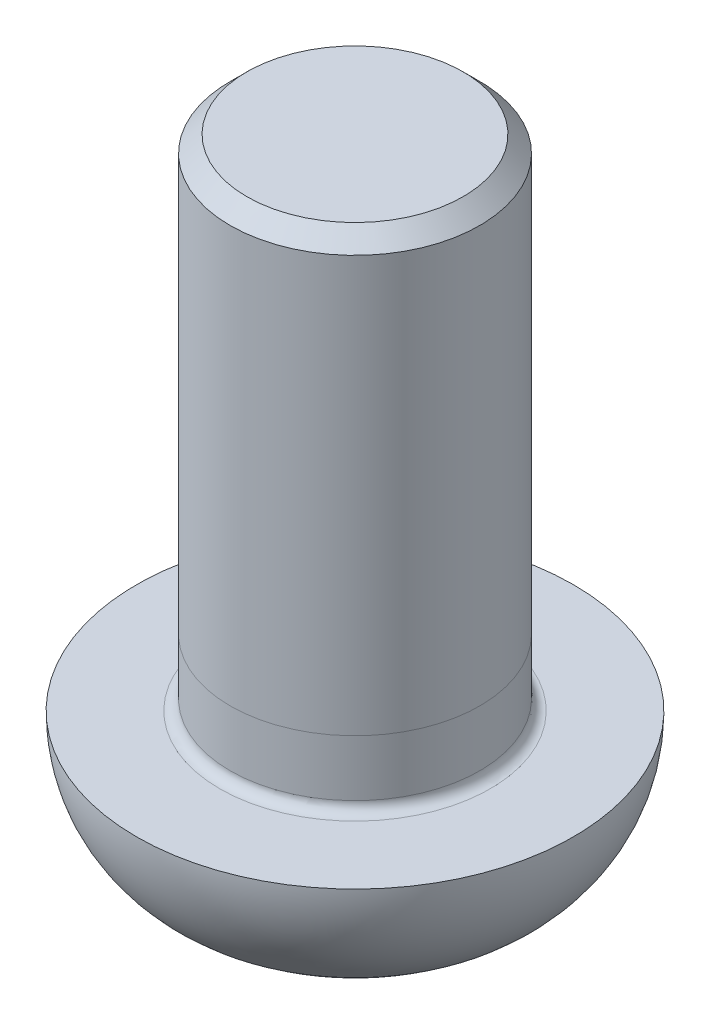
ISO-10303-21;
HEADER;
FILE_DESCRIPTION(('STEP AP214'),'2;1');
FILE_NAME('part.step','',(''),(''),'','','');
FILE_SCHEMA(('AUTOMOTIVE_DESIGN { 1 0 10303 214 1 1 1 1 }'));
ENDSEC;
DATA;
#1=APPLICATION_CONTEXT('core data for automotive mechanical design processes');
#2=APPLICATION_PROTOCOL_DEFINITION('international standard','automotive_design',2000,#1);
#3=PRODUCT_CONTEXT('',#1,'mechanical');
#4=PRODUCT('Part','Part','',(#3));
#5=PRODUCT_RELATED_PRODUCT_CATEGORY('part','',(#4));
#6=PRODUCT_DEFINITION_FORMATION('','',#4);
#7=PRODUCT_DEFINITION_CONTEXT('part definition',#1,'design');
#8=PRODUCT_DEFINITION('design','',#6,#7);
#9=PRODUCT_DEFINITION_SHAPE('','',#8);
#10=(LENGTH_UNIT() NAMED_UNIT(*) SI_UNIT(.MILLI.,.METRE.));
#11=(NAMED_UNIT(*) PLANE_ANGLE_UNIT() SI_UNIT($,.RADIAN.));
#12=(NAMED_UNIT(*) SI_UNIT($,.STERADIAN.) SOLID_ANGLE_UNIT());
#13=UNCERTAINTY_MEASURE_WITH_UNIT(LENGTH_MEASURE(1.E-05),#10,'distance_accuracy_value','');
#14=(GEOMETRIC_REPRESENTATION_CONTEXT(3) GLOBAL_UNCERTAINTY_ASSIGNED_CONTEXT((#13)) GLOBAL_UNIT_ASSIGNED_CONTEXT((#10,
#11,#12)) REPRESENTATION_CONTEXT('',''));
#15=CARTESIAN_POINT('',(0.,0.,0.));
#16=DIRECTION('',(0.,0.,1.));
#17=DIRECTION('',(1.,0.,0.));
#18=AXIS2_PLACEMENT_3D('',#15,#16,#17);
#19=CARTESIAN_POINT('',(0.,0.,0.));
#20=DIRECTION('',(0.,1.,0.));
#21=DIRECTION('',(0.,0.,1.));
#22=AXIS2_PLACEMENT_3D('',#19,#20,#21);
#23=CYLINDRICAL_SURFACE('',#22,3.);
#24=CARTESIAN_POINT('',(0.,11.6,0.));
#25=DIRECTION('',(0.,1.,0.));
#26=DIRECTION('',(0.,0.,1.));
#27=AXIS2_PLACEMENT_3D('',#24,#25,#26);
#28=CIRCLE('',#27,3.);
#29=CARTESIAN_POINT('',(0.,11.6,3.));
#30=VERTEX_POINT('',#29);
#31=EDGE_CURVE('E28',#30,#30,#28,.F.);
#32=ORIENTED_EDGE('',*,*,#31,.T.);
#33=EDGE_LOOP('',(#32));
#34=FACE_BOUND('',#33,.T.);
#35=CARTESIAN_POINT('',(0.,1.6,0.));
#36=DIRECTION('',(0.,1.,0.));
#37=DIRECTION('',(0.,0.,1.));
#38=AXIS2_PLACEMENT_3D('',#35,#36,#37);
#39=CIRCLE('',#38,3.);
#40=CARTESIAN_POINT('',(0.,1.6,3.));
#41=VERTEX_POINT('',#40);
#42=EDGE_CURVE('E11',#41,#41,#39,.T.);
#43=ORIENTED_EDGE('',*,*,#42,.T.);
#44=EDGE_LOOP('',(#43));
#45=FACE_BOUND('',#44,.T.);
#46=ADVANCED_FACE('F18',(#34,#45),#23,.T.);
#47=ORIENTED_EDGE('',*,*,#42,.F.);
#48=EDGE_LOOP('',(#47));
#49=FACE_BOUND('',#48,.T.);
#50=CARTESIAN_POINT('',(0.,0.25,0.));
#51=DIRECTION('',(0.,1.,0.));
#52=DIRECTION('',(0.,0.,1.));
#53=AXIS2_PLACEMENT_3D('',#50,#51,#52);
#54=CIRCLE('',#53,3.);
#55=CARTESIAN_POINT('',(0.,0.25,3.));
#56=VERTEX_POINT('',#55);
#57=EDGE_CURVE('E280',#56,#56,#54,.T.);
#58=ORIENTED_EDGE('',*,*,#57,.T.);
#59=EDGE_LOOP('',(#58));
#60=FACE_BOUND('',#59,.T.);
#61=ADVANCED_FACE('F192',(#49,#60),#23,.T.);
#62=CARTESIAN_POINT('',(5.25,0.,0.));
#63=DIRECTION('',(0.,1.,0.));
#64=DIRECTION('',(0.,0.,1.));
#65=AXIS2_PLACEMENT_3D('',#62,#63,#64);
#66=PLANE('',#65);
#67=CARTESIAN_POINT('',(0.,0.,0.));
#68=DIRECTION('',(0.,1.,0.));
#69=DIRECTION('',(0.,0.,1.));
#70=AXIS2_PLACEMENT_3D('',#67,#68,#69);
#71=CIRCLE('',#70,3.25);
#72=CARTESIAN_POINT('',(0.,0.,3.25));
#73=VERTEX_POINT('',#72);
#74=EDGE_CURVE('E277',#73,#73,#71,.F.);
#75=ORIENTED_EDGE('',*,*,#74,.T.);
#76=EDGE_LOOP('',(#75));
#77=FACE_BOUND('',#76,.T.);
#78=CARTESIAN_POINT('',(0.,0.,0.));
#79=DIRECTION('',(0.,1.,0.));
#80=DIRECTION('',(0.,0.,1.));
#81=AXIS2_PLACEMENT_3D('',#78,#79,#80);
#82=CIRCLE('',#81,5.25);
#83=CARTESIAN_POINT('',(0.,0.,5.25));
#84=VERTEX_POINT('',#83);
#85=EDGE_CURVE('E108',#84,#84,#82,.T.);
#86=ORIENTED_EDGE('',*,*,#85,.T.);
#87=EDGE_LOOP('',(#86));
#88=FACE_BOUND('',#87,.T.);
#89=ADVANCED_FACE('F199',(#77,#88),#66,.T.);
#90=CARTESIAN_POINT('',(0.,12.,0.));
#91=DIRECTION('',(0.,1.,0.));
#92=DIRECTION('',(0.,0.,1.));
#93=AXIS2_PLACEMENT_3D('',#90,#91,#92);
#94=PLANE('',#93);
#95=CARTESIAN_POINT('',(0.,12.,0.));
#96=DIRECTION('',(0.,1.,0.));
#97=DIRECTION('',(0.,0.,1.));
#98=AXIS2_PLACEMENT_3D('',#95,#96,#97);
#99=CIRCLE('',#98,2.6);
#100=CARTESIAN_POINT('',(0.,12.,2.6));
#101=VERTEX_POINT('',#100);
#102=EDGE_CURVE('E282',#101,#101,#99,.T.);
#103=ORIENTED_EDGE('',*,*,#102,.T.);
#104=EDGE_LOOP('',(#103));
#105=FACE_BOUND('',#104,.T.);
#106=ADVANCED_FACE('F227',(#105),#94,.T.);
#107=CARTESIAN_POINT('',(0.,0.25,0.));
#108=DIRECTION('',(0.,1.,0.));
#109=DIRECTION('',(0.,0.,1.));
#110=AXIS2_PLACEMENT_3D('',#107,#108,#109);
#111=TOROIDAL_SURFACE('',#110,3.25,0.25);
#112=ORIENTED_EDGE('',*,*,#74,.F.);
#113=EDGE_LOOP('',(#112));
#114=FACE_BOUND('',#113,.T.);
#115=ORIENTED_EDGE('',*,*,#57,.F.);
#116=EDGE_LOOP('',(#115));
#117=FACE_BOUND('',#116,.T.);
#118=ADVANCED_FACE('F265',(#114,#117),#111,.F.);
#119=CARTESIAN_POINT('',(0.,12.,0.));
#120=DIRECTION('',(0.,-1.,0.));
#121=DIRECTION('',(0.,0.,-1.));
#122=AXIS2_PLACEMENT_3D('',#119,#120,#121);
#123=CONICAL_SURFACE('',#122,2.6,0.785398163397449);
#124=ORIENTED_EDGE('',*,*,#31,.F.);
#125=EDGE_LOOP('',(#124));
#126=FACE_BOUND('',#125,.T.);
#127=ORIENTED_EDGE('',*,*,#102,.F.);
#128=EDGE_LOOP('',(#127));
#129=FACE_BOUND('',#128,.T.);
#130=ADVANCED_FACE('F21',(#126,#129),#123,.T.);
#131=CARTESIAN_POINT('',(0.,0.,0.));
#132=DIRECTION('',(0.,-1.,0.));
#133=DIRECTION('',(0.,0.,-1.));
#134=AXIS2_PLACEMENT_3D('',#131,#132,#133);
#135=DEGENERATE_TOROIDAL_SURFACE('',#134,1.67165208586472,3.57834791413527,.T.);
#136=ORIENTED_EDGE('',*,*,#85,.F.);
#137=EDGE_LOOP('',(#136));
#138=FACE_BOUND('',#137,.T.);
#139=CARTESIAN_POINT('',(0.,-3.3,0.));
#140=DIRECTION('',(0.,-1.,0.));
#141=DIRECTION('',(0.,0.,-1.));
#142=AXIS2_PLACEMENT_3D('',#139,#140,#141);
#143=CIRCLE('',#142,3.05533333333333);
#144=CARTESIAN_POINT('',(0.,-3.3,-3.05533333333333));
#145=VERTEX_POINT('',#144);
#146=EDGE_CURVE('E119',#145,#145,#143,.T.);
#147=ORIENTED_EDGE('',*,*,#146,.F.);
#148=EDGE_LOOP('',(#147));
#149=FACE_BOUND('',#148,.T.);
#150=ADVANCED_FACE('F143',(#138,#149),#135,.T.);
#151=CARTESIAN_POINT('',(0.,0.391673276442843,0.));
#152=DIRECTION('',(0.,-1.,0.));
#153=DIRECTION('',(0.,0.,-1.));
#154=AXIS2_PLACEMENT_3D('',#151,#152,#153);
#155=CONICAL_SURFACE('',#154,0.,1.0471975511966);
#156=CARTESIAN_POINT('',(0.,0.391673276442843,0.));
#157=VERTEX_POINT('',#156);
#158=VERTEX_LOOP('',#157);
#159=FACE_BOUND('',#158,.T.);
#160=CARTESIAN_POINT('',(-1.15458506832542,-0.94172672855691,2.0002));
#161=CARTESIAN_POINT('',(-1.20532911262018,-0.91241679803709,1.91230873709994));
#162=CARTESIAN_POINT('',(-1.2565111744778,-0.885760113916877,1.82365880552641));
#163=CARTESIAN_POINT('',(-1.3597616401932,-0.839229752957131,1.6448237530022));
#164=CARTESIAN_POINT('',(-1.41183187919145,-0.81937253831919,1.55463545349496));
#165=CARTESIAN_POINT('',(-1.51532701829184,-0.788460725959663,1.37537661423669));
#166=CARTESIAN_POINT('',(-1.56673599086579,-0.777200413534941,1.28633366177369));
#167=CARTESIAN_POINT('',(-1.66979593505374,-0.763755924531052,1.10782860221495));
#168=CARTESIAN_POINT('',(-1.72144653186531,-0.76156061688988,1.01836714429604));
#169=CARTESIAN_POINT('',(-1.81796535054794,-0.766118251267061,0.851191646451197));
#170=CARTESIAN_POINT('',(-1.86284799277603,-0.771752136623426,0.773452629734213));
#171=CARTESIAN_POINT('',(-1.95232085557725,-0.789611157197239,0.618481085463865));
#172=CARTESIAN_POINT('',(-1.99691076648955,-0.80184239795985,0.5412490942588));
#173=CARTESIAN_POINT('',(-2.08656822922817,-0.832420698804021,0.385957813517798));
#174=CARTESIAN_POINT('',(-2.13162442866767,-0.850897429002127,0.30791818689262));
#175=CARTESIAN_POINT('',(-2.221064675979,-0.892832780149267,0.153003134307866));
#176=CARTESIAN_POINT('',(-2.26544987045196,-0.916281542428724,0.0761257223768807));
#177=CARTESIAN_POINT('',(-2.30951654681234,-0.941726728556909,-0.000200000000000072));
#178=B_SPLINE_CURVE_WITH_KNOTS('',3,(#160,#161,#162,#163,#164,#165,#166,#167,#168,#169,#170,
#171,#172,#173,#174,#175,#176,#177),.UNSPECIFIED.,.F.,.F.,(4,2,2,2,2,2,2,2,4),(0.,
0.317031824695611,0.634825876346566,0.944753967652639,1.25430138000372,1.52387047293094,
1.79368946861028,2.06949491027634,2.34475850821472),.UNSPECIFIED.);
#179=CARTESIAN_POINT('',(-1.15470053837926,-0.941660056890493,2.));
#180=VERTEX_POINT('',#179);
#181=CARTESIAN_POINT('',(-2.3094010767585,-0.941660056890492,0.));
#182=VERTEX_POINT('',#181);
#183=EDGE_CURVE('E231',#180,#182,#178,.T.);
#184=ORIENTED_EDGE('',*,*,#183,.T.);
#185=CARTESIAN_POINT('',(-2.30951654681234,-0.941726728556909,0.000200000000000068));
#186=CARTESIAN_POINT('',(-2.25877250251757,-0.912416798037087,-0.0876912629000592));
#187=CARTESIAN_POINT('',(-2.20759044065995,-0.885760113916874,-0.17634119447359));
#188=CARTESIAN_POINT('',(-2.10433997494456,-0.839229752957128,-0.355176246997801));
#189=CARTESIAN_POINT('',(-2.0522697359463,-0.819372538319187,-0.445364546505036));
#190=CARTESIAN_POINT('',(-1.94877459684592,-0.78846072595966,-0.624623385763305));
#191=CARTESIAN_POINT('',(-1.89736562427197,-0.777200413534938,-0.713666338226303));
#192=CARTESIAN_POINT('',(-1.79430568008402,-0.76375592453105,-0.892171397785043));
#193=CARTESIAN_POINT('',(-1.74265508327244,-0.761560616889878,-0.981632855703958));
#194=CARTESIAN_POINT('',(-1.64613626458981,-0.766118251267059,-1.1488083535488));
#195=CARTESIAN_POINT('',(-1.60125362236172,-0.771752136623423,-1.22654737026578));
#196=CARTESIAN_POINT('',(-1.5117807595605,-0.789611157197236,-1.38151891453613));
#197=CARTESIAN_POINT('',(-1.46719084864821,-0.801842397959847,-1.4587509057412));
#198=CARTESIAN_POINT('',(-1.37753338590959,-0.832420698804018,-1.6140421864822));
#199=CARTESIAN_POINT('',(-1.33247718647008,-0.850897429002124,-1.69208181310738));
#200=CARTESIAN_POINT('',(-1.24303693915875,-0.892832780149265,-1.84699686569214));
#201=CARTESIAN_POINT('',(-1.19865174468579,-0.916281542428723,-1.92387427762312));
#202=CARTESIAN_POINT('',(-1.15458506832541,-0.94172672855691,-2.0002));
#203=B_SPLINE_CURVE_WITH_KNOTS('',3,(#185,#186,#187,#188,#189,#190,#191,#192,#193,#194,#195,
#196,#197,#198,#199,#200,#201,#202),.UNSPECIFIED.,.F.,.F.,(4,2,2,2,2,2,2,2,4),(0.,
0.317031824695611,0.634825876346565,0.944753967652637,1.25430138000371,1.52387047293094,
1.79368946861029,2.06949491027634,2.34475850821473),.UNSPECIFIED.);
#204=CARTESIAN_POINT('',(-1.15470053837925,-0.941660056890493,-2.));
#205=VERTEX_POINT('',#204);
#206=EDGE_CURVE('E210',#182,#205,#203,.T.);
#207=ORIENTED_EDGE('',*,*,#206,.T.);
#208=CARTESIAN_POINT('',(-3.97107242292986,-2.17538835040825,-2.));
#209=CARTESIAN_POINT('',(-3.87868247277526,-2.12775059746127,-2.));
#210=CARTESIAN_POINT('',(-3.7861588003778,-2.08037372958414,-2.));
#211=CARTESIAN_POINT('',(-3.60078450821548,-1.98626017948102,-2.00000000000001));
#212=CARTESIAN_POINT('',(-3.50793388259158,-1.93952350880157,-2.00000000000001));
#213=CARTESIAN_POINT('',(-3.22850900761148,-1.80030535880982,-2.));
#214=CARTESIAN_POINT('',(-3.04135761037277,-1.70896924768975,-2.));
#215=CARTESIAN_POINT('',(-2.75397555619272,-1.5731154540905,-2.));
#216=CARTESIAN_POINT('',(-2.65454530475032,-1.52690595800733,-2.));
#217=CARTESIAN_POINT('',(-2.45492785759602,-1.43615536855376,-2.));
#218=CARTESIAN_POINT('',(-2.3547406899451,-1.39161421369455,-2.));
#219=CARTESIAN_POINT('',(-2.15350213975009,-1.30470652650298,-2.));
#220=CARTESIAN_POINT('',(-2.05245137959688,-1.26233856057289,-2.));
#221=CARTESIAN_POINT('',(-1.84919030086332,-1.18039650371769,-2.));
#222=CARTESIAN_POINT('',(-1.74697972173689,-1.14082305558609,-2.));
#223=CARTESIAN_POINT('',(-1.52508206994959,-1.05946514421621,-2.));
#224=CARTESIAN_POINT('',(-1.40516322629618,-1.01830385306277,-2.));
#225=CARTESIAN_POINT('',(-1.16321218809007,-0.942832074454553,-2.));
#226=CARTESIAN_POINT('',(-1.04118108489843,-0.908518157540933,-2.));
#227=CARTESIAN_POINT('',(-0.797191699347654,-0.849762632395411,-2.));
#228=CARTESIAN_POINT('',(-0.675277439673617,-0.825143320410585,-2.));
#229=CARTESIAN_POINT('',(-0.42968597996561,-0.78740551194056,-2.));
#230=CARTESIAN_POINT('',(-0.306009864773069,-0.774280224898857,-2.));
#231=CARTESIAN_POINT('',(-0.0561948130021474,-0.761222818220792,-2.));
#232=CARTESIAN_POINT('',(0.0699543957642671,-0.761477523372083,-2.));
#233=CARTESIAN_POINT('',(0.321490472578919,-0.775609005131668,-2.));
#234=CARTESIAN_POINT('',(0.446877078128915,-0.789490231676833,-2.));
#235=CARTESIAN_POINT('',(0.698268076239721,-0.829339251040338,-2.));
#236=CARTESIAN_POINT('',(0.824232704616094,-0.855548309192251,-1.99999999999999));
#237=CARTESIAN_POINT('',(1.07382197335698,-0.917314019236256,-2.));
#238=CARTESIAN_POINT('',(1.19744582529425,-0.952873762658447,-2.));
#239=CARTESIAN_POINT('',(1.43877717975325,-1.02962266424125,-2.));
#240=CARTESIAN_POINT('',(1.55655051066925,-1.07060890554915,-2.));
#241=CARTESIAN_POINT('',(1.79038315988528,-1.15724391469459,-1.99999999999999));
#242=CARTESIAN_POINT('',(1.90644203337208,-1.20289386902531,-1.99999999999999));
#243=CARTESIAN_POINT('',(2.13727613898438,-1.29764227315016,-1.99999999999999));
#244=CARTESIAN_POINT('',(2.25204987258198,-1.3467443434052,-1.99999999999999));
#245=CARTESIAN_POINT('',(2.48048565996255,-1.44747310577301,-1.99999999999999));
#246=CARTESIAN_POINT('',(2.59414765093807,-1.499099939544,-1.99999999999999));
#247=CARTESIAN_POINT('',(2.81406706680889,-1.60122748447267,-1.99999999999999));
#248=CARTESIAN_POINT('',(2.92037405177845,-1.65162191070667,-1.99999999999999));
#249=CARTESIAN_POINT('',(3.1323563665145,-1.75372845058398,-1.99999999999999));
#250=CARTESIAN_POINT('',(3.23803167473215,-1.80544060886685,-1.99999999999999));
#251=CARTESIAN_POINT('',(3.44851064882037,-1.90972549113419,-1.99999999999999));
#252=CARTESIAN_POINT('',(3.55331605390046,-1.96229471304186,-1.99999999999999));
#253=CARTESIAN_POINT('',(3.7624942913087,-2.06826501338616,-1.99999999999999));
#254=CARTESIAN_POINT('',(3.86686716058578,-2.12166601883339,-1.99999999999999));
#255=CARTESIAN_POINT('',(3.97107242292986,-2.17538835040825,-2.));
#256=B_SPLINE_CURVE_WITH_KNOTS('',3,(#208,#209,#210,#211,#212,#213,#214,#215,#216,#217,#218,
#219,#220,#221,#222,#223,#224,#225,#226,#227,#228,#229,#230,#231,#232,#233,#234,#235,#236,#237,
#238,#239,#240,#241,#242,#243,#244,#245,#246,#247,#248,#249,#250,#251,#252,#253,#254,#255),
.UNSPECIFIED.,.F.,.F.,(4,2,2,2,2,2,2,2,2,2,2,2,2,2,2,2,2,2,2,2,2,2,2,4),(0.,0.311842723826934,
0.62369106463389,1.24838758455579,1.57730682351192,1.90621392778465,2.23490119378745,
2.56366381964157,2.94387628317646,3.32389783939494,3.69658721194995,4.06905625447051,
4.44672744508521,4.82452201071132,5.21003920255201,5.59568401496473,5.96965872681082,
6.34372881945369,6.71819725104189,7.09268671728378,7.44561614609446,7.79855754669429,
8.15030525169476,8.50202226264185),.UNSPECIFIED.);
#257=CARTESIAN_POINT('',(1.15470053837925,-0.941660056890493,-2.));
#258=VERTEX_POINT('',#257);
#259=EDGE_CURVE('E106',#205,#258,#256,.T.);
#260=ORIENTED_EDGE('',*,*,#259,.T.);
#261=CARTESIAN_POINT('',(1.15458506832542,-0.941726728556909,-2.0002));
#262=CARTESIAN_POINT('',(1.20532911262018,-0.91241679803709,-1.91230873709994));
#263=CARTESIAN_POINT('',(1.2565111744778,-0.885760113916877,-1.82365880552641));
#264=CARTESIAN_POINT('',(1.3597616401932,-0.839229752957131,-1.6448237530022));
#265=CARTESIAN_POINT('',(1.41183187919145,-0.819372538319189,-1.55463545349496));
#266=CARTESIAN_POINT('',(1.51532701829183,-0.788460725959662,-1.37537661423669));
#267=CARTESIAN_POINT('',(1.56673599086579,-0.777200413534941,-1.2863336617737));
#268=CARTESIAN_POINT('',(1.66979593505373,-0.763755924531052,-1.10782860221496));
#269=CARTESIAN_POINT('',(1.72144653186531,-0.761560616889879,-1.01836714429604));
#270=CARTESIAN_POINT('',(1.81796535054794,-0.76611825126706,-0.851191646451198));
#271=CARTESIAN_POINT('',(1.86284799277603,-0.771752136623425,-0.773452629734215));
#272=CARTESIAN_POINT('',(1.95232085557725,-0.789611157197239,-0.618481085463866));
#273=CARTESIAN_POINT('',(1.99691076648955,-0.80184239795985,-0.541249094258801));
#274=CARTESIAN_POINT('',(2.08656822922816,-0.832420698804021,-0.385957813517798));
#275=CARTESIAN_POINT('',(2.13162442866767,-0.850897429002127,-0.307918186892619));
#276=CARTESIAN_POINT('',(2.221064675979,-0.892832780149267,-0.153003134307864));
#277=CARTESIAN_POINT('',(2.26544987045196,-0.916281542428725,-0.0761257223768781));
#278=CARTESIAN_POINT('',(2.30951654681234,-0.941726728556909,0.000200000000003726));
#279=B_SPLINE_CURVE_WITH_KNOTS('',3,(#261,#262,#263,#264,#265,#266,#267,#268,#269,#270,#271,
#272,#273,#274,#275,#276,#277,#278),.UNSPECIFIED.,.F.,.F.,(4,2,2,2,2,2,2,2,4),(0.,
0.31703182469561,0.634825876346564,0.944753967652637,1.25430138000371,1.52387047293094,
1.79368946861028,2.06949491027634,2.34475850821473),.UNSPECIFIED.);
#280=CARTESIAN_POINT('',(2.3094010767585,-0.941660056890493,0.));
#281=VERTEX_POINT('',#280);
#282=EDGE_CURVE('E255',#258,#281,#279,.T.);
#283=ORIENTED_EDGE('',*,*,#282,.T.);
#284=CARTESIAN_POINT('',(2.30951654681234,-0.941726728556909,-0.000199999999996057));
#285=CARTESIAN_POINT('',(2.25877250251757,-0.912416798037088,0.0876912629000633));
#286=CARTESIAN_POINT('',(2.20759044065995,-0.885760113916875,0.176341194473594));
#287=CARTESIAN_POINT('',(2.10433997494456,-0.839229752957129,0.355176246997805));
#288=CARTESIAN_POINT('',(2.0522697359463,-0.819372538319187,0.445364546505039));
#289=CARTESIAN_POINT('',(1.94877459684592,-0.78846072595966,0.624623385763309));
#290=CARTESIAN_POINT('',(1.89736562427197,-0.777200413534938,0.713666338226308));
#291=CARTESIAN_POINT('',(1.79430568008402,-0.76375592453105,0.892171397785046));
#292=CARTESIAN_POINT('',(1.74265508327243,-0.761560616889878,0.98163285570396));
#293=CARTESIAN_POINT('',(1.64613626458981,-0.766118251267059,1.1488083535488));
#294=CARTESIAN_POINT('',(1.60125362236172,-0.771752136623423,1.22654737026579));
#295=CARTESIAN_POINT('',(1.5117807595605,-0.789611157197236,1.38151891453614));
#296=CARTESIAN_POINT('',(1.46719084864821,-0.801842397959848,1.4587509057412));
#297=CARTESIAN_POINT('',(1.37753338590959,-0.832420698804018,1.6140421864822));
#298=CARTESIAN_POINT('',(1.33247718647008,-0.850897429002125,1.69208181310738));
#299=CARTESIAN_POINT('',(1.24303693915875,-0.892832780149265,1.84699686569214));
#300=CARTESIAN_POINT('',(1.19865174468579,-0.916281542428723,1.92387427762312));
#301=CARTESIAN_POINT('',(1.15458506832541,-0.941726728556909,2.0002));
#302=B_SPLINE_CURVE_WITH_KNOTS('',3,(#284,#285,#286,#287,#288,#289,#290,#291,#292,#293,#294,
#295,#296,#297,#298,#299,#300,#301),.UNSPECIFIED.,.F.,.F.,(4,2,2,2,2,2,2,2,4),(0.,
0.317031824695611,0.634825876346565,0.944753967652638,1.25430138000371,1.52387047293094,
1.79368946861028,2.06949491027634,2.34475850821473),.UNSPECIFIED.);
#303=CARTESIAN_POINT('',(1.15470053837924,-0.941660056890492,2.));
#304=VERTEX_POINT('',#303);
#305=EDGE_CURVE('E249',#281,#304,#302,.T.);
#306=ORIENTED_EDGE('',*,*,#305,.T.);
#307=CARTESIAN_POINT('',(3.97107242292986,-2.17538835040825,2.));
#308=CARTESIAN_POINT('',(3.87868247277525,-2.12775059746126,2.));
#309=CARTESIAN_POINT('',(3.7861588003778,-2.08037372958414,2.00000000000001));
#310=CARTESIAN_POINT('',(3.60078450821547,-1.98626017948102,2.00000000000001));
#311=CARTESIAN_POINT('',(3.50793388259158,-1.93952350880157,2.00000000000001));
#312=CARTESIAN_POINT('',(3.22850900761148,-1.80030535880982,2.));
#313=CARTESIAN_POINT('',(3.04135761037276,-1.70896924768974,2.));
#314=CARTESIAN_POINT('',(2.75397555619272,-1.5731154540905,2.));
#315=CARTESIAN_POINT('',(2.65454530475031,-1.52690595800733,2.));
#316=CARTESIAN_POINT('',(2.45492785759602,-1.43615536855376,2.));
#317=CARTESIAN_POINT('',(2.35474068994509,-1.39161421369454,2.));
#318=CARTESIAN_POINT('',(2.15350213975008,-1.30470652650297,2.));
#319=CARTESIAN_POINT('',(2.05245137959687,-1.26233856057289,2.));
#320=CARTESIAN_POINT('',(1.84919030086332,-1.18039650371768,2.));
#321=CARTESIAN_POINT('',(1.74697972173688,-1.14082305558609,2.));
#322=CARTESIAN_POINT('',(1.52508206994959,-1.05946514421621,2.));
#323=CARTESIAN_POINT('',(1.40516322629617,-1.01830385306277,2.));
#324=CARTESIAN_POINT('',(1.16321218809006,-0.942832074454551,2.));
#325=CARTESIAN_POINT('',(1.04118108489842,-0.90851815754093,2.));
#326=CARTESIAN_POINT('',(0.797191699347647,-0.849762632395409,2.));
#327=CARTESIAN_POINT('',(0.675277439673609,-0.825143320410583,2.));
#328=CARTESIAN_POINT('',(0.429685979965601,-0.787405511940558,2.));
#329=CARTESIAN_POINT('',(0.30600986477306,-0.774280224898856,2.));
#330=CARTESIAN_POINT('',(0.0561948130021376,-0.761222818220792,2.));
#331=CARTESIAN_POINT('',(-0.0699543957642771,-0.761477523372083,2.));
#332=CARTESIAN_POINT('',(-0.32149047257893,-0.775609005131668,2.));
#333=CARTESIAN_POINT('',(-0.446877078128926,-0.789490231676834,2.));
#334=CARTESIAN_POINT('',(-0.698268076239732,-0.82933925104034,2.));
#335=CARTESIAN_POINT('',(-0.824232704616105,-0.855548309192252,1.99999999999999));
#336=CARTESIAN_POINT('',(-1.07382197335699,-0.917314019236258,2.));
#337=CARTESIAN_POINT('',(-1.19744582529427,-0.95287376265845,2.));
#338=CARTESIAN_POINT('',(-1.43877717975326,-1.02962266424125,2.));
#339=CARTESIAN_POINT('',(-1.55655051066926,-1.07060890554915,1.99999999999999));
#340=CARTESIAN_POINT('',(-1.79038315988529,-1.15724391469459,1.99999999999999));
#341=CARTESIAN_POINT('',(-1.90644203337209,-1.20289386902531,1.99999999999999));
#342=CARTESIAN_POINT('',(-2.13727613898438,-1.29764227315017,1.99999999999999));
#343=CARTESIAN_POINT('',(-2.25204987258199,-1.3467443434052,1.99999999999999));
#344=CARTESIAN_POINT('',(-2.48048565996256,-1.44747310577301,1.99999999999999));
#345=CARTESIAN_POINT('',(-2.59414765093807,-1.499099939544,1.99999999999999));
#346=CARTESIAN_POINT('',(-2.81406706680889,-1.60122748447267,1.99999999999999));
#347=CARTESIAN_POINT('',(-2.92037405177846,-1.65162191070667,1.99999999999999));
#348=CARTESIAN_POINT('',(-3.1323563665145,-1.75372845058398,1.99999999999999));
#349=CARTESIAN_POINT('',(-3.23803167473215,-1.80544060886684,1.99999999999999));
#350=CARTESIAN_POINT('',(-3.44851064882038,-1.90972549113419,1.99999999999999));
#351=CARTESIAN_POINT('',(-3.55331605390046,-1.96229471304186,1.99999999999999));
#352=CARTESIAN_POINT('',(-3.7624942913087,-2.06826501338616,1.99999999999999));
#353=CARTESIAN_POINT('',(-3.86686716058578,-2.12166601883338,1.99999999999999));
#354=CARTESIAN_POINT('',(-3.97107242292986,-2.17538835040825,2.));
#355=B_SPLINE_CURVE_WITH_KNOTS('',3,(#307,#308,#309,#310,#311,#312,#313,#314,#315,#316,#317,
#318,#319,#320,#321,#322,#323,#324,#325,#326,#327,#328,#329,#330,#331,#332,#333,#334,#335,#336,
#337,#338,#339,#340,#341,#342,#343,#344,#345,#346,#347,#348,#349,#350,#351,#352,#353,#354),
.UNSPECIFIED.,.F.,.F.,(4,2,2,2,2,2,2,2,2,2,2,2,2,2,2,2,2,2,2,2,2,2,2,4),(0.,0.311842723826934,
0.623691064633889,1.24838758455579,1.57730682351192,1.90621392778465,2.23490119378744,
2.56366381964157,2.94387628317646,3.32389783939494,3.69658721194995,4.06905625447051,
4.44672744508521,4.82452201071133,5.21003920255201,5.59568401496474,5.96965872681082,
6.34372881945369,6.71819725104189,7.09268671728378,7.44561614609446,7.79855754669429,
8.15030525169475,8.50202226264184),.UNSPECIFIED.);
#356=EDGE_CURVE('E241',#304,#180,#355,.T.);
#357=ORIENTED_EDGE('',*,*,#356,.T.);
#358=EDGE_LOOP('',(#184,#207,#260,#283,#306,#357));
#359=FACE_BOUND('',#358,.T.);
#360=ADVANCED_FACE('F176',(#159,#359),#155,.F.);
#361=CARTESIAN_POINT('',(-1.15470053837925,18.0211162934777,-2.));
#362=DIRECTION('',(0.,0.,-1.));
#363=DIRECTION('',(-1.,0.,0.));
#364=AXIS2_PLACEMENT_3D('',#361,#362,#363);
#365=PLANE('',#364);
#366=CARTESIAN_POINT('',(3.54576846416073,-3.77200034906827,-2.));
#367=CARTESIAN_POINT('',(3.46032331155691,-3.75206057830072,-1.99999999999999));
#368=CARTESIAN_POINT('',(3.37484047761441,-3.73228232054218,-1.99999999999999));
#369=CARTESIAN_POINT('',(3.20378355240315,-3.69311847013324,-1.99999999999999));
#370=CARTESIAN_POINT('',(3.11820945972395,-3.67373288364707,-1.99999999999999));
#371=CARTESIAN_POINT('',(2.86130062428642,-3.61626384835692,-1.99999999999999));
#372=CARTESIAN_POINT('',(2.68980910024909,-3.57887512354549,-1.99999999999999));
#373=CARTESIAN_POINT('',(2.34458511529228,-3.50643853365192,-1.99999999999999));
#374=CARTESIAN_POINT('',(2.1708470844132,-3.47141698135254,-1.99999999999999));
#375=CARTESIAN_POINT('',(1.82256095831907,-3.40547978469486,-1.99999999999999));
#376=CARTESIAN_POINT('',(1.64801278540453,-3.37456454295519,-1.99999999999999));
#377=CARTESIAN_POINT('',(1.30271990845848,-3.31969790886641,-1.99999999999999));
#378=CARTESIAN_POINT('',(1.13200256296387,-3.29557843402185,-2.));
#379=CARTESIAN_POINT('',(0.789571689000483,-3.25587323584062,-2.));
#380=CARTESIAN_POINT('',(0.6178584998347,-3.24028476073478,-2.));
#381=CARTESIAN_POINT('',(0.36019540394543,-3.22525401912313,-2.));
#382=CARTESIAN_POINT('',(0.274483715684513,-3.22163460627376,-2.));
#383=CARTESIAN_POINT('',(0.102984480205782,-3.21731952917178,-2.));
#384=CARTESIAN_POINT('',(0.0171969334570651,-3.21662384696397,-2.));
#385=CARTESIAN_POINT('',(-0.15435587366281,-3.21819853237707,-2.));
#386=CARTESIAN_POINT('',(-0.240121132206929,-3.22046909420923,-2.));
#387=CARTESIAN_POINT('',(-0.411526390365097,-3.22785312413437,-2.));
#388=CARTESIAN_POINT('',(-0.497166389972947,-3.23296659236802,-2.));
#389=CARTESIAN_POINT('',(-0.706478859815856,-3.24865578967162,-2.));
#390=CARTESIAN_POINT('',(-0.830044925850673,-3.26065132303124,-2.));
#391=CARTESIAN_POINT('',(-1.07664653209346,-3.28907898341361,-2.));
#392=CARTESIAN_POINT('',(-1.19968208520209,-3.30551100192753,-2.));
#393=CARTESIAN_POINT('',(-1.44564714901042,-3.34186148211041,-2.));
#394=CARTESIAN_POINT('',(-1.5685749476794,-3.36179135163048,-2.));
#395=CARTESIAN_POINT('',(-1.81398159923811,-3.40425123821713,-2.));
#396=CARTESIAN_POINT('',(-1.93646042849967,-3.42678139015956,-2.));
#397=CARTESIAN_POINT('',(-2.18362417007064,-3.47428425653496,-2.));
#398=CARTESIAN_POINT('',(-2.30830103623406,-3.49929851142906,-2.));
#399=CARTESIAN_POINT('',(-2.55733999903382,-3.55084664791934,-2.));
#400=CARTESIAN_POINT('',(-2.68170209177125,-3.57738054824321,-2.));
#401=CARTESIAN_POINT('',(-2.92946437432295,-3.6314395789905,-2.));
#402=CARTESIAN_POINT('',(-3.05286599737638,-3.65895817166457,-2.));
#403=CARTESIAN_POINT('',(-3.29945995688185,-3.71487849715073,-2.));
#404=CARTESIAN_POINT('',(-3.4226523077504,-3.74328016629155,-2.));
#405=CARTESIAN_POINT('',(-3.54576846416072,-3.77200034906825,-2.));
#406=B_SPLINE_CURVE_WITH_KNOTS('',3,(#366,#367,#368,#369,#370,#371,#372,#373,#374,#375,#376,
#377,#378,#379,#380,#381,#382,#383,#384,#385,#386,#387,#388,#389,#390,#391,#392,#393,#394,#395,
#396,#397,#398,#399,#400,#401,#402,#403,#404,#405),.UNSPECIFIED.,.F.,.F.,(4,2,2,2,2,2,2,2,2,2,2,
2,2,2,2,2,2,2,2,4),(0.,0.263222401305707,0.526448931537519,1.05299375162049,1.58466125538442,
2.11638085006353,2.63348257137836,3.15041739730247,3.40773776741521,3.66505655727231,
3.92239219561216,4.17972784668617,4.55206097335712,4.92438499422329,5.29794667206535,
5.67152773515151,6.05299963584967,6.434476238713,6.81377086422973,7.1930382051055),.UNSPECIFIED.);
#407=CARTESIAN_POINT('',(1.15470053837925,-3.3,-2.));
#408=VERTEX_POINT('',#407);
#409=CARTESIAN_POINT('',(-1.15470053837925,-3.3,-2.));
#410=VERTEX_POINT('',#409);
#411=EDGE_CURVE('E87',#408,#410,#406,.T.);
#412=ORIENTED_EDGE('',*,*,#411,.F.);
#413=DIRECTION('',(0.,-1.,0.));
#414=VECTOR('',#413,1.);
#415=CARTESIAN_POINT('',(1.15470053837925,18.0211162934777,-2.));
#416=LINE('',#415,#414);
#417=EDGE_CURVE('E109',#258,#408,#416,.T.);
#418=ORIENTED_EDGE('',*,*,#417,.F.);
#419=ORIENTED_EDGE('',*,*,#259,.F.);
#420=DIRECTION('',(0.,-1.,0.));
#421=VECTOR('',#420,1.);
#422=CARTESIAN_POINT('',(-1.15470053837925,18.0211162934777,-2.));
#423=LINE('',#422,#421);
#424=EDGE_CURVE('E99',#205,#410,#423,.T.);
#425=ORIENTED_EDGE('',*,*,#424,.T.);
#426=EDGE_LOOP('',(#412,#418,#419,#425));
#427=FACE_BOUND('',#426,.T.);
#428=ADVANCED_FACE('F104',(#427),#365,.F.);
#429=CARTESIAN_POINT('',(1.15470053837925,18.0211162934777,-2.));
#430=DIRECTION('',(0.866025403784439,0.,-0.5));
#431=DIRECTION('',(-0.5,0.,-0.86602540378444));
#432=AXIS2_PLACEMENT_3D('',#429,#430,#431);
#433=PLANE('',#432);
#434=CARTESIAN_POINT('',(2.30951654681234,-3.30003094242808,0.000200000000003903));
#435=CARTESIAN_POINT('',(2.26155517902373,-3.28717294728116,-0.0828715258103692));
#436=CARTESIAN_POINT('',(2.21350683851658,-3.27549990930549,-0.166093692788128));
#437=CARTESIAN_POINT('',(2.11724043254796,-3.25499135519067,-0.332831998987827));
#438=CARTESIAN_POINT('',(2.06902230613691,-3.24615699216786,-0.416348243777553));
#439=CARTESIAN_POINT('',(1.97270874423801,-3.231841640157,-0.58316822644438));
#440=CARTESIAN_POINT('',(1.92461396034488,-3.22634357564339,-0.666470835726323));
#441=CARTESIAN_POINT('',(1.8283630443694,-3.21897122197136,-0.833182312470901));
#442=CARTESIAN_POINT('',(1.78020692596914,-3.21709623134525,-0.91659115623545));
#443=CARTESIAN_POINT('',(1.68389468916862,-3.21709623134525,-1.08340884376455));
#444=CARTESIAN_POINT('',(1.63573857076836,-3.21897122197136,-1.1668176875291));
#445=CARTESIAN_POINT('',(1.53948765479288,-3.22634357564339,-1.33352916427368));
#446=CARTESIAN_POINT('',(1.49139287089975,-3.231841640157,-1.41683177355562));
#447=CARTESIAN_POINT('',(1.39507930900085,-3.24615699216786,-1.58365175622245));
#448=CARTESIAN_POINT('',(1.3468611825898,-3.25499135519067,-1.66716800101217));
#449=CARTESIAN_POINT('',(1.25059477662118,-3.27549990930549,-1.83390630721187));
#450=CARTESIAN_POINT('',(1.20254643611403,-3.28717294728116,-1.91712847418963));
#451=CARTESIAN_POINT('',(1.15458506832542,-3.30003094242808,-2.0002));
#452=B_SPLINE_CURVE_WITH_KNOTS('',3,(#434,#435,#436,#437,#438,#439,#440,#441,#442,#443,#444,
#445,#446,#447,#448,#449,#450,#451),.UNSPECIFIED.,.F.,.F.,(4,2,2,2,2,2,2,2,4),(0.,
0.290357249044671,0.580832297293914,0.869807841095771,1.15872743038697,1.44764701967818,
1.73662256348003,2.02709761172928,2.31745486077395),.UNSPECIFIED.);
#453=CARTESIAN_POINT('',(2.30940107675851,-3.3,0.));
#454=VERTEX_POINT('',#453);
#455=EDGE_CURVE('E94',#454,#408,#452,.T.);
#456=ORIENTED_EDGE('',*,*,#455,.F.);
#457=DIRECTION('',(0.,-1.,0.));
#458=VECTOR('',#457,1.);
#459=CARTESIAN_POINT('',(2.3094010767585,18.0211162934777,0.));
#460=LINE('',#459,#458);
#461=EDGE_CURVE('E313',#281,#454,#460,.T.);
#462=ORIENTED_EDGE('',*,*,#461,.F.);
#463=ORIENTED_EDGE('',*,*,#282,.F.);
#464=ORIENTED_EDGE('',*,*,#417,.T.);
#465=EDGE_LOOP('',(#456,#462,#463,#464));
#466=FACE_BOUND('',#465,.T.);
#467=ADVANCED_FACE('F175',(#466),#433,.F.);
#468=CARTESIAN_POINT('',(2.3094010767585,18.0211162934777,0.));
#469=DIRECTION('',(0.866025403784437,0.,0.5));
#470=DIRECTION('',(0.5,0.,-0.866025403784438));
#471=AXIS2_PLACEMENT_3D('',#468,#469,#470);
#472=PLANE('',#471);
#473=CARTESIAN_POINT('',(1.15458506832541,-3.30003094242808,2.0002));
#474=CARTESIAN_POINT('',(1.20254643611402,-3.28717294728116,1.91712847418963));
#475=CARTESIAN_POINT('',(1.25059477662117,-3.27549990930549,1.83390630721187));
#476=CARTESIAN_POINT('',(1.34686118258979,-3.25499135519067,1.66716800101217));
#477=CARTESIAN_POINT('',(1.39507930900085,-3.24615699216786,1.58365175622245));
#478=CARTESIAN_POINT('',(1.49139287089975,-3.231841640157,1.41683177355562));
#479=CARTESIAN_POINT('',(1.53948765479288,-3.22634357564339,1.33352916427368));
#480=CARTESIAN_POINT('',(1.63573857076836,-3.21897122197136,1.1668176875291));
#481=CARTESIAN_POINT('',(1.68389468916862,-3.21709623134525,1.08340884376455));
#482=CARTESIAN_POINT('',(1.78020692596913,-3.21709623134525,0.916591156235453));
#483=CARTESIAN_POINT('',(1.82836304436939,-3.21897122197136,0.833182312470904));
#484=CARTESIAN_POINT('',(1.92461396034487,-3.22634357564339,0.666470835726327));
#485=CARTESIAN_POINT('',(1.972708744238,-3.231841640157,0.583168226444384));
#486=CARTESIAN_POINT('',(2.0690223061369,-3.24615699216786,0.416348243777556));
#487=CARTESIAN_POINT('',(2.11724043254796,-3.25499135519067,0.332831998987831));
#488=CARTESIAN_POINT('',(2.21350683851658,-3.27549990930549,0.166093692788132));
#489=CARTESIAN_POINT('',(2.26155517902373,-3.28717294728116,0.0828715258103743));
#490=CARTESIAN_POINT('',(2.30951654681234,-3.30003094242808,-0.00019999999999655));
#491=B_SPLINE_CURVE_WITH_KNOTS('',3,(#473,#474,#475,#476,#477,#478,#479,#480,#481,#482,#483,
#484,#485,#486,#487,#488,#489,#490),.UNSPECIFIED.,.F.,.F.,(4,2,2,2,2,2,2,2,4),(0.,
0.290357249044671,0.580832297293914,0.869807841095771,1.15872743038697,1.44764701967818,
1.73662256348003,2.02709761172928,2.31745486077395),.UNSPECIFIED.);
#492=CARTESIAN_POINT('',(1.15470053837925,-3.3,2.));
#493=VERTEX_POINT('',#492);
#494=EDGE_CURVE('E128',#493,#454,#491,.T.);
#495=ORIENTED_EDGE('',*,*,#494,.F.);
#496=DIRECTION('',(0.,-1.,0.));
#497=VECTOR('',#496,1.);
#498=CARTESIAN_POINT('',(1.15470053837924,18.0211162934777,2.));
#499=LINE('',#498,#497);
#500=EDGE_CURVE('E310',#304,#493,#499,.T.);
#501=ORIENTED_EDGE('',*,*,#500,.F.);
#502=ORIENTED_EDGE('',*,*,#305,.F.);
#503=ORIENTED_EDGE('',*,*,#461,.T.);
#504=EDGE_LOOP('',(#495,#501,#502,#503));
#505=FACE_BOUND('',#504,.T.);
#506=ADVANCED_FACE('F179',(#505),#472,.F.);
#507=CARTESIAN_POINT('',(1.15470053837924,18.0211162934777,2.));
#508=DIRECTION('',(0.,0.,1.));
#509=DIRECTION('',(1.,0.,0.));
#510=AXIS2_PLACEMENT_3D('',#507,#508,#509);
#511=PLANE('',#510);
#512=CARTESIAN_POINT('',(-3.54576846416073,-3.77200034906825,2.));
#513=CARTESIAN_POINT('',(-3.46032331155691,-3.7520605783007,1.99999999999999));
#514=CARTESIAN_POINT('',(-3.37484047761441,-3.73228232054217,1.99999999999999));
#515=CARTESIAN_POINT('',(-3.20378355240315,-3.69311847013323,1.99999999999999));
#516=CARTESIAN_POINT('',(-3.11820945972395,-3.67373288364706,1.99999999999999));
#517=CARTESIAN_POINT('',(-2.86130062428642,-3.61626384835691,1.99999999999999));
#518=CARTESIAN_POINT('',(-2.68980910024909,-3.57887512354548,1.99999999999999));
#519=CARTESIAN_POINT('',(-2.34458511529227,-3.50643853365191,1.99999999999999));
#520=CARTESIAN_POINT('',(-2.1708470844132,-3.47141698135253,1.99999999999999));
#521=CARTESIAN_POINT('',(-1.82256095831907,-3.40547978469485,1.99999999999999));
#522=CARTESIAN_POINT('',(-1.64801278540452,-3.37456454295518,1.99999999999999));
#523=CARTESIAN_POINT('',(-1.30271990845847,-3.3196979088664,1.99999999999999));
#524=CARTESIAN_POINT('',(-1.13200256296387,-3.29557843402184,1.99999999999999));
#525=CARTESIAN_POINT('',(-0.789571689000479,-3.25587323584062,2.));
#526=CARTESIAN_POINT('',(-0.617858499834696,-3.24028476073478,2.));
#527=CARTESIAN_POINT('',(-0.360195403945427,-3.22525401912313,2.));
#528=CARTESIAN_POINT('',(-0.274483715684509,-3.22163460627376,2.));
#529=CARTESIAN_POINT('',(-0.102984480205778,-3.21731952917178,2.));
#530=CARTESIAN_POINT('',(-0.0171969334570617,-3.21662384696397,2.));
#531=CARTESIAN_POINT('',(0.154355873662813,-3.21819853237707,2.));
#532=CARTESIAN_POINT('',(0.240121132206932,-3.22046909420923,2.));
#533=CARTESIAN_POINT('',(0.4115263903651,-3.22785312413437,2.));
#534=CARTESIAN_POINT('',(0.49716638997295,-3.23296659236802,2.));
#535=CARTESIAN_POINT('',(0.706478859815859,-3.24865578967162,2.));
#536=CARTESIAN_POINT('',(0.830044925850675,-3.26065132303124,2.));
#537=CARTESIAN_POINT('',(1.07664653209346,-3.28907898341361,2.));
#538=CARTESIAN_POINT('',(1.19968208520209,-3.30551100192753,2.));
#539=CARTESIAN_POINT('',(1.44564714901042,-3.34186148211042,2.));
#540=CARTESIAN_POINT('',(1.56857494767939,-3.36179135163049,2.));
#541=CARTESIAN_POINT('',(1.81398159923811,-3.40425123821714,2.));
#542=CARTESIAN_POINT('',(1.93646042849966,-3.42678139015956,2.));
#543=CARTESIAN_POINT('',(2.18362417007064,-3.47428425653496,2.));
#544=CARTESIAN_POINT('',(2.30830103623405,-3.49929851142906,2.));
#545=CARTESIAN_POINT('',(2.55733999903381,-3.55084664791935,2.));
#546=CARTESIAN_POINT('',(2.68170209177124,-3.57738054824322,2.));
#547=CARTESIAN_POINT('',(2.92946437432295,-3.63143957899051,2.));
#548=CARTESIAN_POINT('',(3.05286599737637,-3.65895817166458,2.00000000000001));
#549=CARTESIAN_POINT('',(3.29945995688184,-3.71487849715075,2.));
#550=CARTESIAN_POINT('',(3.42265230775039,-3.74328016629156,2.));
#551=CARTESIAN_POINT('',(3.54576846416072,-3.77200034906826,2.));
#552=B_SPLINE_CURVE_WITH_KNOTS('',3,(#512,#513,#514,#515,#516,#517,#518,#519,#520,#521,#522,
#523,#524,#525,#526,#527,#528,#529,#530,#531,#532,#533,#534,#535,#536,#537,#538,#539,#540,#541,
#542,#543,#544,#545,#546,#547,#548,#549,#550,#551),.UNSPECIFIED.,.F.,.F.,(4,2,2,2,2,2,2,2,2,2,2,
2,2,2,2,2,2,2,2,4),(0.,0.263222401305707,0.526448931537519,1.05299375162049,1.58466125538442,
2.11638085006353,2.63348257137836,3.15041739730247,3.40773776741521,3.66505655727231,
3.92239219561216,4.17972784668617,4.55206097335711,4.92438499422329,5.29794667206534,
5.67152773515151,6.05299963584966,6.43447623871299,6.81377086422972,7.19303820510548),.UNSPECIFIED.);
#553=CARTESIAN_POINT('',(-1.15470053837926,-3.3,2.));
#554=VERTEX_POINT('',#553);
#555=EDGE_CURVE('E81',#554,#493,#552,.T.);
#556=ORIENTED_EDGE('',*,*,#555,.F.);
#557=DIRECTION('',(0.,-1.,0.));
#558=VECTOR('',#557,1.);
#559=CARTESIAN_POINT('',(-1.15470053837926,18.0211162934777,2.));
#560=LINE('',#559,#558);
#561=EDGE_CURVE('E42',#180,#554,#560,.T.);
#562=ORIENTED_EDGE('',*,*,#561,.F.);
#563=ORIENTED_EDGE('',*,*,#356,.F.);
#564=ORIENTED_EDGE('',*,*,#500,.T.);
#565=EDGE_LOOP('',(#556,#562,#563,#564));
#566=FACE_BOUND('',#565,.T.);
#567=ADVANCED_FACE('F135',(#566),#511,.F.);
#568=CARTESIAN_POINT('',(-1.15470053837926,18.0211162934777,2.));
#569=DIRECTION('',(-0.86602540378444,0.,0.5));
#570=DIRECTION('',(0.5,0.,0.86602540378444));
#571=AXIS2_PLACEMENT_3D('',#568,#569,#570);
#572=PLANE('',#571);
#573=CARTESIAN_POINT('',(-2.30951654681234,-3.30003094242807,-0.000199999999999873));
#574=CARTESIAN_POINT('',(-2.26155517902373,-3.28717294728115,0.0828715258103725));
#575=CARTESIAN_POINT('',(-2.21350683851658,-3.27549990930549,0.166093692788131));
#576=CARTESIAN_POINT('',(-2.11724043254796,-3.25499135519067,0.33283199898783));
#577=CARTESIAN_POINT('',(-2.06902230613691,-3.24615699216785,0.416348243777555));
#578=CARTESIAN_POINT('',(-1.97270874423801,-3.23184164015699,0.583168226444383));
#579=CARTESIAN_POINT('',(-1.92461396034488,-3.22634357564339,0.666470835726326));
#580=CARTESIAN_POINT('',(-1.8283630443694,-3.21897122197136,0.833182312470903));
#581=CARTESIAN_POINT('',(-1.78020692596914,-3.21709623134524,0.916591156235452));
#582=CARTESIAN_POINT('',(-1.68389468916862,-3.21709623134524,1.08340884376455));
#583=CARTESIAN_POINT('',(-1.63573857076836,-3.21897122197136,1.1668176875291));
#584=CARTESIAN_POINT('',(-1.53948765479288,-3.22634357564339,1.33352916427368));
#585=CARTESIAN_POINT('',(-1.49139287089976,-3.23184164015699,1.41683177355562));
#586=CARTESIAN_POINT('',(-1.39507930900085,-3.24615699216786,1.58365175622245));
#587=CARTESIAN_POINT('',(-1.3468611825898,-3.25499135519067,1.66716800101217));
#588=CARTESIAN_POINT('',(-1.25059477662118,-3.27549990930549,1.83390630721187));
#589=CARTESIAN_POINT('',(-1.20254643611403,-3.28717294728115,1.91712847418963));
#590=CARTESIAN_POINT('',(-1.15458506832542,-3.30003094242807,2.0002));
#591=B_SPLINE_CURVE_WITH_KNOTS('',3,(#573,#574,#575,#576,#577,#578,#579,#580,#581,#582,#583,
#584,#585,#586,#587,#588,#589,#590),.UNSPECIFIED.,.F.,.F.,(4,2,2,2,2,2,2,2,4),(0.,
0.29035724904467,0.580832297293913,0.86980784109577,1.15872743038697,1.44764701967817,
1.73662256348003,2.02709761172927,2.31745486077394),.UNSPECIFIED.);
#592=CARTESIAN_POINT('',(-2.3094010767585,-3.3,0.));
#593=VERTEX_POINT('',#592);
#594=EDGE_CURVE('E149',#593,#554,#591,.T.);
#595=ORIENTED_EDGE('',*,*,#594,.F.);
#596=DIRECTION('',(0.,-1.,0.));
#597=VECTOR('',#596,1.);
#598=CARTESIAN_POINT('',(-2.3094010767585,18.0211162934777,0.));
#599=LINE('',#598,#597);
#600=EDGE_CURVE('E102',#182,#593,#599,.T.);
#601=ORIENTED_EDGE('',*,*,#600,.F.);
#602=ORIENTED_EDGE('',*,*,#183,.F.);
#603=ORIENTED_EDGE('',*,*,#561,.T.);
#604=EDGE_LOOP('',(#595,#601,#602,#603));
#605=FACE_BOUND('',#604,.T.);
#606=ADVANCED_FACE('F188',(#605),#572,.F.);
#607=CARTESIAN_POINT('',(-2.3094010767585,18.0211162934777,0.));
#608=DIRECTION('',(-0.866025403784439,0.,-0.5));
#609=DIRECTION('',(-0.5,0.,0.866025403784439));
#610=AXIS2_PLACEMENT_3D('',#607,#608,#609);
#611=PLANE('',#610);
#612=CARTESIAN_POINT('',(-1.15458506832541,-3.30003094242807,-2.0002));
#613=CARTESIAN_POINT('',(-1.20254643611402,-3.28717294728115,-1.91712847418963));
#614=CARTESIAN_POINT('',(-1.25059477662117,-3.27549990930549,-1.83390630721187));
#615=CARTESIAN_POINT('',(-1.34686118258979,-3.25499135519067,-1.66716800101217));
#616=CARTESIAN_POINT('',(-1.39507930900085,-3.24615699216785,-1.58365175622245));
#617=CARTESIAN_POINT('',(-1.49139287089975,-3.23184164015699,-1.41683177355562));
#618=CARTESIAN_POINT('',(-1.53948765479288,-3.22634357564338,-1.33352916427368));
#619=CARTESIAN_POINT('',(-1.63573857076836,-3.21897122197135,-1.1668176875291));
#620=CARTESIAN_POINT('',(-1.68389468916862,-3.21709623134524,-1.08340884376455));
#621=CARTESIAN_POINT('',(-1.78020692596913,-3.21709623134524,-0.91659115623545));
#622=CARTESIAN_POINT('',(-1.82836304436939,-3.21897122197135,-0.833182312470901));
#623=CARTESIAN_POINT('',(-1.92461396034487,-3.22634357564338,-0.666470835726324));
#624=CARTESIAN_POINT('',(-1.972708744238,-3.23184164015699,-0.583168226444381));
#625=CARTESIAN_POINT('',(-2.0690223061369,-3.24615699216785,-0.416348243777553));
#626=CARTESIAN_POINT('',(-2.11724043254796,-3.25499135519066,-0.332831998987827));
#627=CARTESIAN_POINT('',(-2.21350683851658,-3.27549990930549,-0.166093692788128));
#628=CARTESIAN_POINT('',(-2.26155517902373,-3.28717294728115,-0.0828715258103706));
#629=CARTESIAN_POINT('',(-2.30951654681234,-3.30003094242807,0.000200000000000337));
#630=B_SPLINE_CURVE_WITH_KNOTS('',3,(#612,#613,#614,#615,#616,#617,#618,#619,#620,#621,#622,
#623,#624,#625,#626,#627,#628,#629),.UNSPECIFIED.,.F.,.F.,(4,2,2,2,2,2,2,2,4),(0.,
0.290357249044671,0.580832297293914,0.869807841095772,1.15872743038697,1.44764701967818,
1.73662256348003,2.02709761172928,2.31745486077395),.UNSPECIFIED.);
#631=EDGE_CURVE('E34',#410,#593,#630,.T.);
#632=ORIENTED_EDGE('',*,*,#631,.F.);
#633=ORIENTED_EDGE('',*,*,#424,.F.);
#634=ORIENTED_EDGE('',*,*,#206,.F.);
#635=ORIENTED_EDGE('',*,*,#600,.T.);
#636=EDGE_LOOP('',(#632,#633,#634,#635));
#637=FACE_BOUND('',#636,.T.);
#638=ADVANCED_FACE('F98',(#637),#611,.F.);
#639=CARTESIAN_POINT('',(0.,-2.68119784648299,0.));
#640=DIRECTION('',(0.,-1.,0.));
#641=DIRECTION('',(1.,0.,0.));
#642=AXIS2_PLACEMENT_3D('',#639,#640,#641);
#643=CONICAL_SURFACE('',#642,0.,1.30899693899575);
#644=ORIENTED_EDGE('',*,*,#411,.T.);
#645=CARTESIAN_POINT('',(0.,-3.3,0.));
#646=DIRECTION('',(0.,-1.,0.));
#647=DIRECTION('',(1.,0.,0.));
#648=AXIS2_PLACEMENT_3D('',#645,#646,#647);
#649=CIRCLE('',#648,2.30940107675851);
#650=EDGE_CURVE('E82',#410,#408,#649,.T.);
#651=ORIENTED_EDGE('',*,*,#650,.T.);
#652=EDGE_LOOP('',(#644,#651));
#653=FACE_BOUND('',#652,.T.);
#654=ADVANCED_FACE('F88',(#653),#643,.F.);
#655=ORIENTED_EDGE('',*,*,#455,.T.);
#656=EDGE_CURVE('E115',#408,#454,#649,.T.);
#657=ORIENTED_EDGE('',*,*,#656,.T.);
#658=EDGE_LOOP('',(#655,#657));
#659=FACE_BOUND('',#658,.T.);
#660=ADVANCED_FACE('F324',(#659),#643,.F.);
#661=ORIENTED_EDGE('',*,*,#494,.T.);
#662=EDGE_CURVE('E116',#454,#493,#649,.T.);
#663=ORIENTED_EDGE('',*,*,#662,.T.);
#664=EDGE_LOOP('',(#661,#663));
#665=FACE_BOUND('',#664,.T.);
#666=ADVANCED_FACE('F326',(#665),#643,.F.);
#667=ORIENTED_EDGE('',*,*,#555,.T.);
#668=EDGE_CURVE('E294',#493,#554,#649,.T.);
#669=ORIENTED_EDGE('',*,*,#668,.T.);
#670=EDGE_LOOP('',(#667,#669));
#671=FACE_BOUND('',#670,.T.);
#672=ADVANCED_FACE('F295',(#671),#643,.F.);
#673=ORIENTED_EDGE('',*,*,#594,.T.);
#674=EDGE_CURVE('E84',#554,#593,#649,.T.);
#675=ORIENTED_EDGE('',*,*,#674,.T.);
#676=EDGE_LOOP('',(#673,#675));
#677=FACE_BOUND('',#676,.T.);
#678=ADVANCED_FACE('F142',(#677),#643,.F.);
#679=ORIENTED_EDGE('',*,*,#631,.T.);
#680=EDGE_CURVE('E75',#593,#410,#649,.T.);
#681=ORIENTED_EDGE('',*,*,#680,.T.);
#682=EDGE_LOOP('',(#679,#681));
#683=FACE_BOUND('',#682,.T.);
#684=ADVANCED_FACE('F77',(#683),#643,.F.);
#685=CARTESIAN_POINT('',(0.,-3.3,0.));
#686=DIRECTION('',(0.,-1.,0.));
#687=DIRECTION('',(0.,0.,-1.));
#688=AXIS2_PLACEMENT_3D('',#685,#686,#687);
#689=PLANE('',#688);
#690=ORIENTED_EDGE('',*,*,#680,.F.);
#691=ORIENTED_EDGE('',*,*,#674,.F.);
#692=ORIENTED_EDGE('',*,*,#668,.F.);
#693=ORIENTED_EDGE('',*,*,#662,.F.);
#694=ORIENTED_EDGE('',*,*,#656,.F.);
#695=ORIENTED_EDGE('',*,*,#650,.F.);
#696=EDGE_LOOP('',(#690,#691,#692,#693,#694,#695));
#697=FACE_BOUND('',#696,.T.);
#698=ORIENTED_EDGE('',*,*,#146,.T.);
#699=EDGE_LOOP('',(#698));
#700=FACE_BOUND('',#699,.T.);
#701=ADVANCED_FACE('F112',(#697,#700),#689,.T.);
#702=CLOSED_SHELL('',(#46,#61,#89,#106,#118,#130,#150,#360,#428,#467,#506,#567,#606,#638,#654,
#660,#666,#672,#678,#684,#701));
#703=MANIFOLD_SOLID_BREP('B1',#702);
#704=ADVANCED_BREP_SHAPE_REPRESENTATION('',(#18,#703),#14);
#705=SHAPE_DEFINITION_REPRESENTATION(#9,#704);
ENDSEC;
END-ISO-10303-21;
